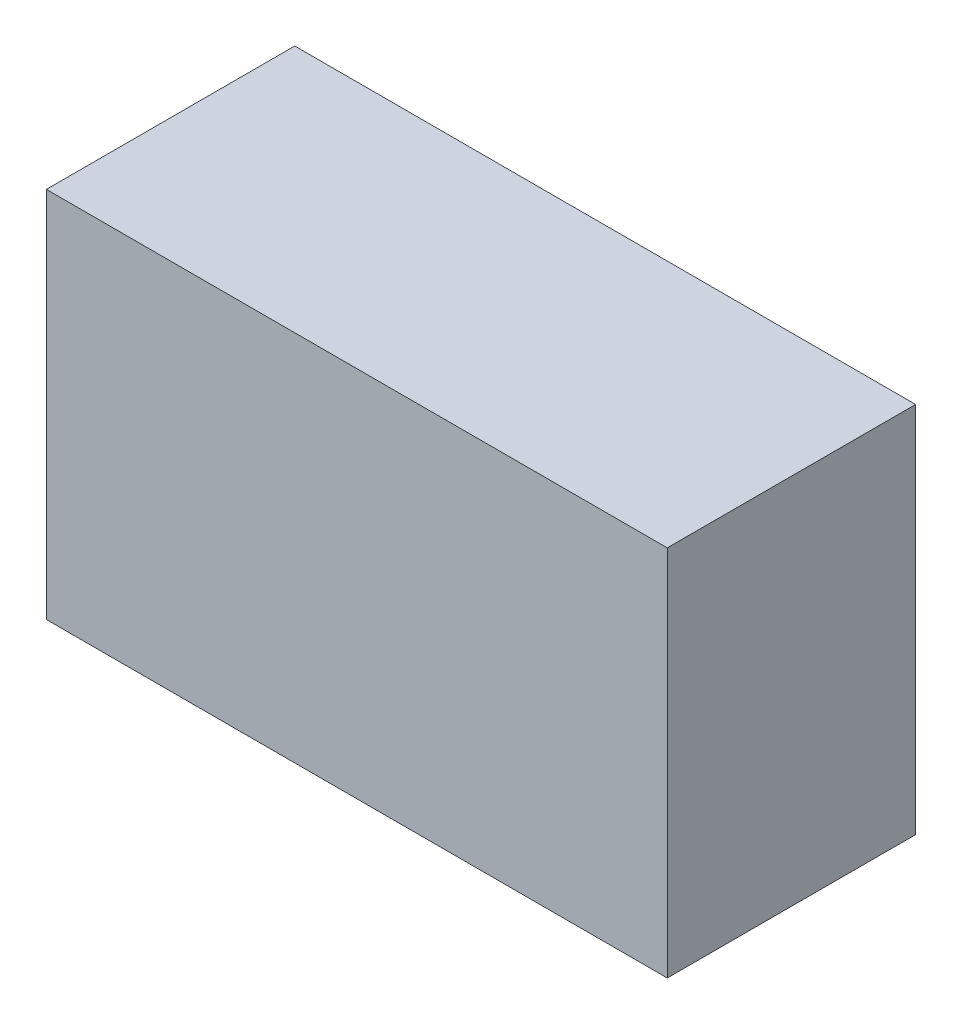
ISO-10303-21;
HEADER;
FILE_DESCRIPTION(('STEP AP214'),'2;1');
FILE_NAME('part.step','',(''),(''),'','','');
FILE_SCHEMA(('AUTOMOTIVE_DESIGN { 1 0 10303 214 1 1 1 1 }'));
ENDSEC;
DATA;
#1=APPLICATION_CONTEXT('core data for automotive mechanical design processes');
#2=APPLICATION_PROTOCOL_DEFINITION('international standard','automotive_design',2000,#1);
#3=PRODUCT_CONTEXT('',#1,'mechanical');
#4=PRODUCT('Part','Part','',(#3));
#5=PRODUCT_RELATED_PRODUCT_CATEGORY('part','',(#4));
#6=PRODUCT_DEFINITION_FORMATION('','',#4);
#7=PRODUCT_DEFINITION_CONTEXT('part definition',#1,'design');
#8=PRODUCT_DEFINITION('design','',#6,#7);
#9=PRODUCT_DEFINITION_SHAPE('','',#8);
#10=(LENGTH_UNIT() NAMED_UNIT(*) SI_UNIT(.MILLI.,.METRE.));
#11=(NAMED_UNIT(*) PLANE_ANGLE_UNIT() SI_UNIT($,.RADIAN.));
#12=(NAMED_UNIT(*) SI_UNIT($,.STERADIAN.) SOLID_ANGLE_UNIT());
#13=UNCERTAINTY_MEASURE_WITH_UNIT(LENGTH_MEASURE(1.E-05),#10,'distance_accuracy_value','');
#14=(GEOMETRIC_REPRESENTATION_CONTEXT(3) GLOBAL_UNCERTAINTY_ASSIGNED_CONTEXT((#13)) GLOBAL_UNIT_ASSIGNED_CONTEXT((#10,
#11,#12)) REPRESENTATION_CONTEXT('',''));
#15=CARTESIAN_POINT('',(0.,0.,0.));
#16=DIRECTION('',(0.,0.,1.));
#17=DIRECTION('',(1.,0.,0.));
#18=AXIS2_PLACEMENT_3D('',#15,#16,#17);
#19=CARTESIAN_POINT('',(-25.,-15.,20.));
#20=DIRECTION('',(1.,0.,0.));
#21=DIRECTION('',(0.,0.,-1.));
#22=AXIS2_PLACEMENT_3D('',#19,#20,#21);
#23=PLANE('',#22);
#24=DIRECTION('',(0.,-1.,0.));
#25=VECTOR('',#24,1.);
#26=CARTESIAN_POINT('',(-25.,-15.,0.));
#27=LINE('',#26,#25);
#28=CARTESIAN_POINT('',(-25.,15.,0.));
#29=VERTEX_POINT('',#28);
#30=CARTESIAN_POINT('',(-25.,-15.,0.));
#31=VERTEX_POINT('',#30);
#32=EDGE_CURVE('E105',#29,#31,#27,.T.);
#33=ORIENTED_EDGE('',*,*,#32,.T.);
#34=DIRECTION('',(0.,0.,-1.));
#35=VECTOR('',#34,1.);
#36=CARTESIAN_POINT('',(-25.,-15.,20.));
#37=LINE('',#36,#35);
#38=CARTESIAN_POINT('',(-25.,-15.,20.));
#39=VERTEX_POINT('',#38);
#40=EDGE_CURVE('E11',#39,#31,#37,.T.);
#41=ORIENTED_EDGE('',*,*,#40,.F.);
#42=DIRECTION('',(0.,-1.,0.));
#43=VECTOR('',#42,1.);
#44=CARTESIAN_POINT('',(-25.,-15.,20.));
#45=LINE('',#44,#43);
#46=CARTESIAN_POINT('',(-25.,15.,20.));
#47=VERTEX_POINT('',#46);
#48=EDGE_CURVE('E89',#47,#39,#45,.T.);
#49=ORIENTED_EDGE('',*,*,#48,.F.);
#50=DIRECTION('',(0.,0.,-1.));
#51=VECTOR('',#50,1.);
#52=CARTESIAN_POINT('',(-25.,15.,20.));
#53=LINE('',#52,#51);
#54=EDGE_CURVE('E98',#47,#29,#53,.T.);
#55=ORIENTED_EDGE('',*,*,#54,.T.);
#56=EDGE_LOOP('',(#33,#41,#49,#55));
#57=FACE_BOUND('',#56,.T.);
#58=ADVANCED_FACE('F39',(#57),#23,.F.);
#59=CARTESIAN_POINT('',(-25.,-15.,20.));
#60=DIRECTION('',(0.,1.,0.));
#61=DIRECTION('',(0.,0.,1.));
#62=AXIS2_PLACEMENT_3D('',#59,#60,#61);
#63=PLANE('',#62);
#64=DIRECTION('',(1.,0.,0.));
#65=VECTOR('',#64,1.);
#66=CARTESIAN_POINT('',(-25.,-15.,0.));
#67=LINE('',#66,#65);
#68=CARTESIAN_POINT('',(25.,-15.,0.));
#69=VERTEX_POINT('',#68);
#70=EDGE_CURVE('E94',#31,#69,#67,.T.);
#71=ORIENTED_EDGE('',*,*,#70,.T.);
#72=DIRECTION('',(0.,0.,-1.));
#73=VECTOR('',#72,1.);
#74=CARTESIAN_POINT('',(25.,-15.,20.));
#75=LINE('',#74,#73);
#76=CARTESIAN_POINT('',(25.,-15.,20.));
#77=VERTEX_POINT('',#76);
#78=EDGE_CURVE('E50',#77,#69,#75,.T.);
#79=ORIENTED_EDGE('',*,*,#78,.F.);
#80=DIRECTION('',(1.,0.,0.));
#81=VECTOR('',#80,1.);
#82=CARTESIAN_POINT('',(-25.,-15.,20.));
#83=LINE('',#82,#81);
#84=EDGE_CURVE('E83',#39,#77,#83,.T.);
#85=ORIENTED_EDGE('',*,*,#84,.F.);
#86=ORIENTED_EDGE('',*,*,#40,.T.);
#87=EDGE_LOOP('',(#71,#79,#85,#86));
#88=FACE_BOUND('',#87,.T.);
#89=ADVANCED_FACE('F91',(#88),#63,.F.);
#90=CARTESIAN_POINT('',(25.,-15.,20.));
#91=DIRECTION('',(-1.,0.,0.));
#92=DIRECTION('',(0.,0.,1.));
#93=AXIS2_PLACEMENT_3D('',#90,#91,#92);
#94=PLANE('',#93);
#95=DIRECTION('',(0.,1.,0.));
#96=VECTOR('',#95,1.);
#97=CARTESIAN_POINT('',(25.,-15.,0.));
#98=LINE('',#97,#96);
#99=CARTESIAN_POINT('',(25.,15.,0.));
#100=VERTEX_POINT('',#99);
#101=EDGE_CURVE('E75',#69,#100,#98,.T.);
#102=ORIENTED_EDGE('',*,*,#101,.T.);
#103=DIRECTION('',(0.,0.,-1.));
#104=VECTOR('',#103,1.);
#105=CARTESIAN_POINT('',(25.,15.,20.));
#106=LINE('',#105,#104);
#107=CARTESIAN_POINT('',(25.,15.,20.));
#108=VERTEX_POINT('',#107);
#109=EDGE_CURVE('E92',#108,#100,#106,.T.);
#110=ORIENTED_EDGE('',*,*,#109,.F.);
#111=DIRECTION('',(0.,1.,0.));
#112=VECTOR('',#111,1.);
#113=CARTESIAN_POINT('',(25.,-15.,20.));
#114=LINE('',#113,#112);
#115=EDGE_CURVE('E86',#77,#108,#114,.T.);
#116=ORIENTED_EDGE('',*,*,#115,.F.);
#117=ORIENTED_EDGE('',*,*,#78,.T.);
#118=EDGE_LOOP('',(#102,#110,#116,#117));
#119=FACE_BOUND('',#118,.T.);
#120=ADVANCED_FACE('F96',(#119),#94,.F.);
#121=CARTESIAN_POINT('',(-25.,15.,20.));
#122=DIRECTION('',(0.,-1.,0.));
#123=DIRECTION('',(0.,0.,-1.));
#124=AXIS2_PLACEMENT_3D('',#121,#122,#123);
#125=PLANE('',#124);
#126=DIRECTION('',(-1.,0.,0.));
#127=VECTOR('',#126,1.);
#128=CARTESIAN_POINT('',(-25.,15.,0.));
#129=LINE('',#128,#127);
#130=EDGE_CURVE('E80',#100,#29,#129,.T.);
#131=ORIENTED_EDGE('',*,*,#130,.T.);
#132=ORIENTED_EDGE('',*,*,#54,.F.);
#133=DIRECTION('',(-1.,0.,0.));
#134=VECTOR('',#133,1.);
#135=CARTESIAN_POINT('',(-25.,15.,20.));
#136=LINE('',#135,#134);
#137=EDGE_CURVE('E54',#108,#47,#136,.T.);
#138=ORIENTED_EDGE('',*,*,#137,.F.);
#139=ORIENTED_EDGE('',*,*,#109,.T.);
#140=EDGE_LOOP('',(#131,#132,#138,#139));
#141=FACE_BOUND('',#140,.T.);
#142=ADVANCED_FACE('F108',(#141),#125,.F.);
#143=CARTESIAN_POINT('',(0.,0.,20.));
#144=DIRECTION('',(0.,0.,-1.));
#145=DIRECTION('',(-1.,0.,0.));
#146=AXIS2_PLACEMENT_3D('',#143,#144,#145);
#147=PLANE('',#146);
#148=ORIENTED_EDGE('',*,*,#48,.T.);
#149=ORIENTED_EDGE('',*,*,#84,.T.);
#150=ORIENTED_EDGE('',*,*,#115,.T.);
#151=ORIENTED_EDGE('',*,*,#137,.T.);
#152=EDGE_LOOP('',(#148,#149,#150,#151));
#153=FACE_BOUND('',#152,.T.);
#154=ADVANCED_FACE('F88',(#153),#147,.F.);
#155=CARTESIAN_POINT('',(0.,0.,0.));
#156=DIRECTION('',(0.,0.,-1.));
#157=DIRECTION('',(-1.,0.,0.));
#158=AXIS2_PLACEMENT_3D('',#155,#156,#157);
#159=PLANE('',#158);
#160=ORIENTED_EDGE('',*,*,#32,.F.);
#161=ORIENTED_EDGE('',*,*,#130,.F.);
#162=ORIENTED_EDGE('',*,*,#101,.F.);
#163=ORIENTED_EDGE('',*,*,#70,.F.);
#164=EDGE_LOOP('',(#160,#161,#162,#163));
#165=FACE_BOUND('',#164,.T.);
#166=ADVANCED_FACE('F115',(#165),#159,.T.);
#167=CLOSED_SHELL('',(#58,#89,#120,#142,#154,#166));
#168=MANIFOLD_SOLID_BREP('B2',#167);
#169=ADVANCED_BREP_SHAPE_REPRESENTATION('',(#18,#168),#14);
#170=SHAPE_DEFINITION_REPRESENTATION(#9,#169);
ENDSEC;
END-ISO-10303-21;
